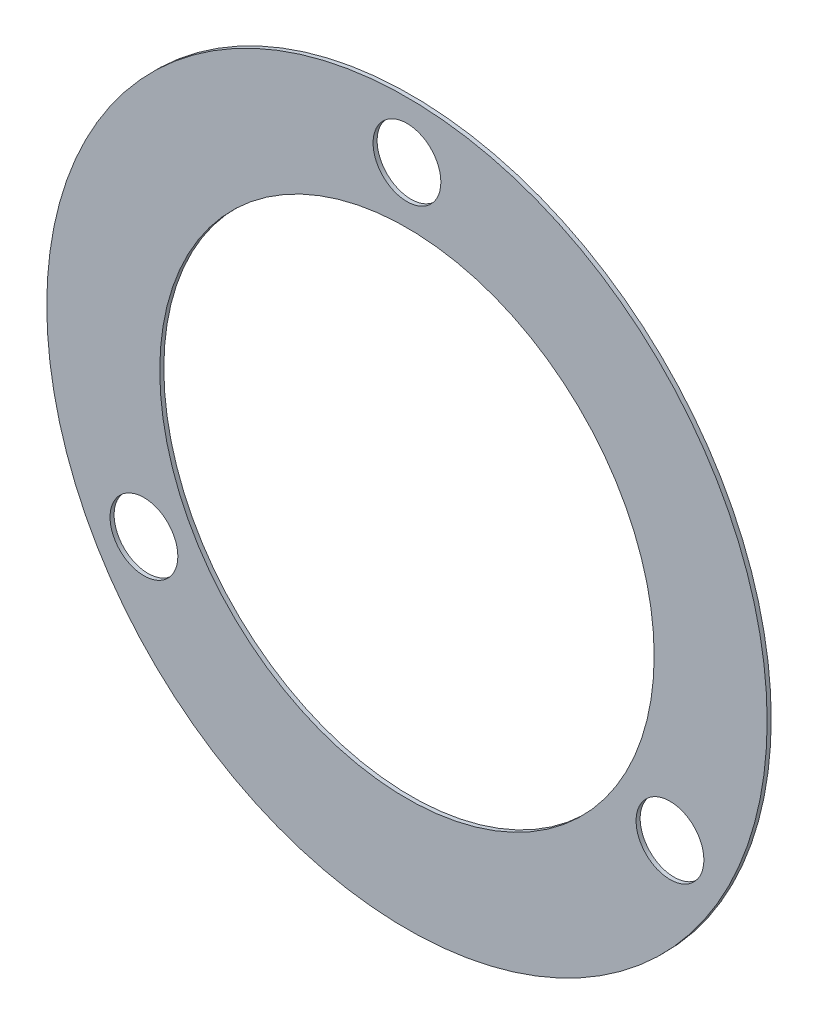
ISO-10303-21;
HEADER;
FILE_DESCRIPTION(('STEP AP214'),'2;1');
FILE_NAME('part.step','',(''),(''),'','','');
FILE_SCHEMA(('AUTOMOTIVE_DESIGN { 1 0 10303 214 1 1 1 1 }'));
ENDSEC;
DATA;
#1=APPLICATION_CONTEXT('core data for automotive mechanical design processes');
#2=APPLICATION_PROTOCOL_DEFINITION('international standard','automotive_design',2000,#1);
#3=PRODUCT_CONTEXT('',#1,'mechanical');
#4=PRODUCT('Part','Part','',(#3));
#5=PRODUCT_RELATED_PRODUCT_CATEGORY('part','',(#4));
#6=PRODUCT_DEFINITION_FORMATION('','',#4);
#7=PRODUCT_DEFINITION_CONTEXT('part definition',#1,'design');
#8=PRODUCT_DEFINITION('design','',#6,#7);
#9=PRODUCT_DEFINITION_SHAPE('','',#8);
#10=(LENGTH_UNIT() NAMED_UNIT(*) SI_UNIT(.MILLI.,.METRE.));
#11=(NAMED_UNIT(*) PLANE_ANGLE_UNIT() SI_UNIT($,.RADIAN.));
#12=(NAMED_UNIT(*) SI_UNIT($,.STERADIAN.) SOLID_ANGLE_UNIT());
#13=UNCERTAINTY_MEASURE_WITH_UNIT(LENGTH_MEASURE(1.E-05),#10,'distance_accuracy_value','');
#14=(GEOMETRIC_REPRESENTATION_CONTEXT(3) GLOBAL_UNCERTAINTY_ASSIGNED_CONTEXT((#13)) GLOBAL_UNIT_ASSIGNED_CONTEXT((#10,
#11,#12)) REPRESENTATION_CONTEXT('',''));
#15=CARTESIAN_POINT('',(0.,0.,0.));
#16=DIRECTION('',(0.,0.,1.));
#17=DIRECTION('',(1.,0.,0.));
#18=AXIS2_PLACEMENT_3D('',#15,#16,#17);
#19=CARTESIAN_POINT('',(0.,0.,0.2286));
#20=DIRECTION('',(0.,0.,1.));
#21=DIRECTION('',(1.,0.,0.));
#22=AXIS2_PLACEMENT_3D('',#19,#20,#21);
#23=PLANE('',#22);
#24=CARTESIAN_POINT('',(14.7820144121158,-8.53440000000008,0.2286));
#25=DIRECTION('',(0.,0.,1.));
#26=DIRECTION('',(1.,0.,0.));
#27=AXIS2_PLACEMENT_3D('',#24,#25,#26);
#28=CIRCLE('',#27,1.905);
#29=CARTESIAN_POINT('',(16.6870144121158,-8.53440000000008,0.2286));
#30=VERTEX_POINT('',#29);
#31=EDGE_CURVE('E55',#30,#30,#28,.T.);
#32=ORIENTED_EDGE('',*,*,#31,.F.);
#33=EDGE_LOOP('',(#32));
#34=FACE_BOUND('',#33,.T.);
#35=CARTESIAN_POINT('',(0.,0.,0.2286));
#36=DIRECTION('',(0.,0.,1.));
#37=DIRECTION('',(1.,0.,0.));
#38=AXIS2_PLACEMENT_3D('',#35,#36,#37);
#39=CIRCLE('',#38,13.8938);
#40=CARTESIAN_POINT('',(13.8938,0.,0.2286));
#41=VERTEX_POINT('',#40);
#42=EDGE_CURVE('E44',#41,#41,#39,.T.);
#43=ORIENTED_EDGE('',*,*,#42,.F.);
#44=EDGE_LOOP('',(#43));
#45=FACE_BOUND('',#44,.T.);
#46=CARTESIAN_POINT('',(0.,0.,0.2286));
#47=DIRECTION('',(0.,0.,1.));
#48=DIRECTION('',(1.,0.,0.));
#49=AXIS2_PLACEMENT_3D('',#46,#47,#48);
#50=CIRCLE('',#49,20.2438);
#51=CARTESIAN_POINT('',(20.2438,0.,0.2286));
#52=VERTEX_POINT('',#51);
#53=EDGE_CURVE('E10',#52,#52,#50,.T.);
#54=ORIENTED_EDGE('',*,*,#53,.T.);
#55=EDGE_LOOP('',(#54));
#56=FACE_BOUND('',#55,.T.);
#57=CARTESIAN_POINT('',(0.,17.0688,0.2286));
#58=DIRECTION('',(0.,0.,1.));
#59=DIRECTION('',(1.,0.,0.));
#60=AXIS2_PLACEMENT_3D('',#57,#58,#59);
#61=CIRCLE('',#60,1.905);
#62=CARTESIAN_POINT('',(1.905,17.0688,0.2286));
#63=VERTEX_POINT('',#62);
#64=EDGE_CURVE('E49',#63,#63,#61,.T.);
#65=ORIENTED_EDGE('',*,*,#64,.F.);
#66=EDGE_LOOP('',(#65));
#67=FACE_BOUND('',#66,.T.);
#68=CARTESIAN_POINT('',(-14.7820144121158,-8.53440000000007,0.2286));
#69=DIRECTION('',(0.,0.,1.));
#70=DIRECTION('',(1.,0.,0.));
#71=AXIS2_PLACEMENT_3D('',#68,#69,#70);
#72=CIRCLE('',#71,1.905);
#73=CARTESIAN_POINT('',(-12.8770144121158,-8.53440000000007,0.2286));
#74=VERTEX_POINT('',#73);
#75=EDGE_CURVE('E61',#74,#74,#72,.T.);
#76=ORIENTED_EDGE('',*,*,#75,.F.);
#77=EDGE_LOOP('',(#76));
#78=FACE_BOUND('',#77,.T.);
#79=ADVANCED_FACE('F33',(#34,#45,#56,#67,#78),#23,.T.);
#80=CARTESIAN_POINT('',(0.,0.,0.));
#81=DIRECTION('',(0.,0.,1.));
#82=DIRECTION('',(1.,0.,0.));
#83=AXIS2_PLACEMENT_3D('',#80,#81,#82);
#84=PLANE('',#83);
#85=CARTESIAN_POINT('',(0.,0.,0.));
#86=DIRECTION('',(0.,0.,1.));
#87=DIRECTION('',(1.,0.,0.));
#88=AXIS2_PLACEMENT_3D('',#85,#86,#87);
#89=CIRCLE('',#88,20.2438);
#90=CARTESIAN_POINT('',(20.2438,0.,0.));
#91=VERTEX_POINT('',#90);
#92=EDGE_CURVE('E37',#91,#91,#89,.T.);
#93=ORIENTED_EDGE('',*,*,#92,.F.);
#94=EDGE_LOOP('',(#93));
#95=FACE_BOUND('',#94,.T.);
#96=CARTESIAN_POINT('',(0.,0.,0.));
#97=DIRECTION('',(0.,0.,1.));
#98=DIRECTION('',(1.,0.,0.));
#99=AXIS2_PLACEMENT_3D('',#96,#97,#98);
#100=CIRCLE('',#99,13.8938);
#101=CARTESIAN_POINT('',(13.8938,0.,0.));
#102=VERTEX_POINT('',#101);
#103=EDGE_CURVE('E46',#102,#102,#100,.T.);
#104=ORIENTED_EDGE('',*,*,#103,.T.);
#105=EDGE_LOOP('',(#104));
#106=FACE_BOUND('',#105,.T.);
#107=CARTESIAN_POINT('',(0.,17.0688,0.));
#108=DIRECTION('',(0.,0.,1.));
#109=DIRECTION('',(1.,0.,0.));
#110=AXIS2_PLACEMENT_3D('',#107,#108,#109);
#111=CIRCLE('',#110,1.905);
#112=CARTESIAN_POINT('',(1.905,17.0688,0.));
#113=VERTEX_POINT('',#112);
#114=EDGE_CURVE('E52',#113,#113,#111,.T.);
#115=ORIENTED_EDGE('',*,*,#114,.T.);
#116=EDGE_LOOP('',(#115));
#117=FACE_BOUND('',#116,.T.);
#118=CARTESIAN_POINT('',(14.7820144121158,-8.53440000000008,0.));
#119=DIRECTION('',(0.,0.,1.));
#120=DIRECTION('',(1.,0.,0.));
#121=AXIS2_PLACEMENT_3D('',#118,#119,#120);
#122=CIRCLE('',#121,1.905);
#123=CARTESIAN_POINT('',(16.6870144121158,-8.53440000000008,0.));
#124=VERTEX_POINT('',#123);
#125=EDGE_CURVE('E58',#124,#124,#122,.T.);
#126=ORIENTED_EDGE('',*,*,#125,.T.);
#127=EDGE_LOOP('',(#126));
#128=FACE_BOUND('',#127,.T.);
#129=CARTESIAN_POINT('',(-14.7820144121158,-8.53440000000007,0.));
#130=DIRECTION('',(0.,0.,1.));
#131=DIRECTION('',(1.,0.,0.));
#132=AXIS2_PLACEMENT_3D('',#129,#130,#131);
#133=CIRCLE('',#132,1.905);
#134=CARTESIAN_POINT('',(-12.8770144121158,-8.53440000000007,0.));
#135=VERTEX_POINT('',#134);
#136=EDGE_CURVE('E64',#135,#135,#133,.T.);
#137=ORIENTED_EDGE('',*,*,#136,.T.);
#138=EDGE_LOOP('',(#137));
#139=FACE_BOUND('',#138,.T.);
#140=ADVANCED_FACE('F74',(#95,#106,#117,#128,#139),#84,.F.);
#141=CARTESIAN_POINT('',(0.,0.,0.2286));
#142=DIRECTION('',(0.,0.,-1.));
#143=DIRECTION('',(-1.,0.,0.));
#144=AXIS2_PLACEMENT_3D('',#141,#142,#143);
#145=CYLINDRICAL_SURFACE('',#144,20.2438);
#146=ORIENTED_EDGE('',*,*,#53,.F.);
#147=EDGE_LOOP('',(#146));
#148=FACE_BOUND('',#147,.T.);
#149=ORIENTED_EDGE('',*,*,#92,.T.);
#150=EDGE_LOOP('',(#149));
#151=FACE_BOUND('',#150,.T.);
#152=ADVANCED_FACE('F35',(#148,#151),#145,.T.);
#153=CARTESIAN_POINT('',(0.,0.,0.2286));
#154=DIRECTION('',(0.,0.,-1.));
#155=DIRECTION('',(-1.,0.,0.));
#156=AXIS2_PLACEMENT_3D('',#153,#154,#155);
#157=CYLINDRICAL_SURFACE('',#156,13.8938);
#158=ORIENTED_EDGE('',*,*,#42,.T.);
#159=EDGE_LOOP('',(#158));
#160=FACE_BOUND('',#159,.T.);
#161=ORIENTED_EDGE('',*,*,#103,.F.);
#162=EDGE_LOOP('',(#161));
#163=FACE_BOUND('',#162,.T.);
#164=ADVANCED_FACE('F84',(#160,#163),#157,.F.);
#165=CARTESIAN_POINT('',(0.,17.0688,0.2286));
#166=DIRECTION('',(0.,0.,-1.));
#167=DIRECTION('',(-1.,0.,0.));
#168=AXIS2_PLACEMENT_3D('',#165,#166,#167);
#169=CYLINDRICAL_SURFACE('',#168,1.905);
#170=ORIENTED_EDGE('',*,*,#64,.T.);
#171=EDGE_LOOP('',(#170));
#172=FACE_BOUND('',#171,.T.);
#173=ORIENTED_EDGE('',*,*,#114,.F.);
#174=EDGE_LOOP('',(#173));
#175=FACE_BOUND('',#174,.T.);
#176=ADVANCED_FACE('F87',(#172,#175),#169,.F.);
#177=CARTESIAN_POINT('',(14.7820144121158,-8.53440000000008,0.2286));
#178=DIRECTION('',(0.,0.,-1.));
#179=DIRECTION('',(-1.,0.,0.));
#180=AXIS2_PLACEMENT_3D('',#177,#178,#179);
#181=CYLINDRICAL_SURFACE('',#180,1.905);
#182=ORIENTED_EDGE('',*,*,#31,.T.);
#183=EDGE_LOOP('',(#182));
#184=FACE_BOUND('',#183,.T.);
#185=ORIENTED_EDGE('',*,*,#125,.F.);
#186=EDGE_LOOP('',(#185));
#187=FACE_BOUND('',#186,.T.);
#188=ADVANCED_FACE('F91',(#184,#187),#181,.F.);
#189=CARTESIAN_POINT('',(-14.7820144121158,-8.53440000000007,0.2286));
#190=DIRECTION('',(0.,0.,-1.));
#191=DIRECTION('',(-1.,0.,0.));
#192=AXIS2_PLACEMENT_3D('',#189,#190,#191);
#193=CYLINDRICAL_SURFACE('',#192,1.905);
#194=ORIENTED_EDGE('',*,*,#75,.T.);
#195=EDGE_LOOP('',(#194));
#196=FACE_BOUND('',#195,.T.);
#197=ORIENTED_EDGE('',*,*,#136,.F.);
#198=EDGE_LOOP('',(#197));
#199=FACE_BOUND('',#198,.T.);
#200=ADVANCED_FACE('F70',(#196,#199),#193,.F.);
#201=CLOSED_SHELL('',(#79,#140,#152,#164,#176,#188,#200));
#202=MANIFOLD_SOLID_BREP('B2',#201);
#203=ADVANCED_BREP_SHAPE_REPRESENTATION('',(#18,#202),#14);
#204=SHAPE_DEFINITION_REPRESENTATION(#9,#203);
ENDSEC;
END-ISO-10303-21;
